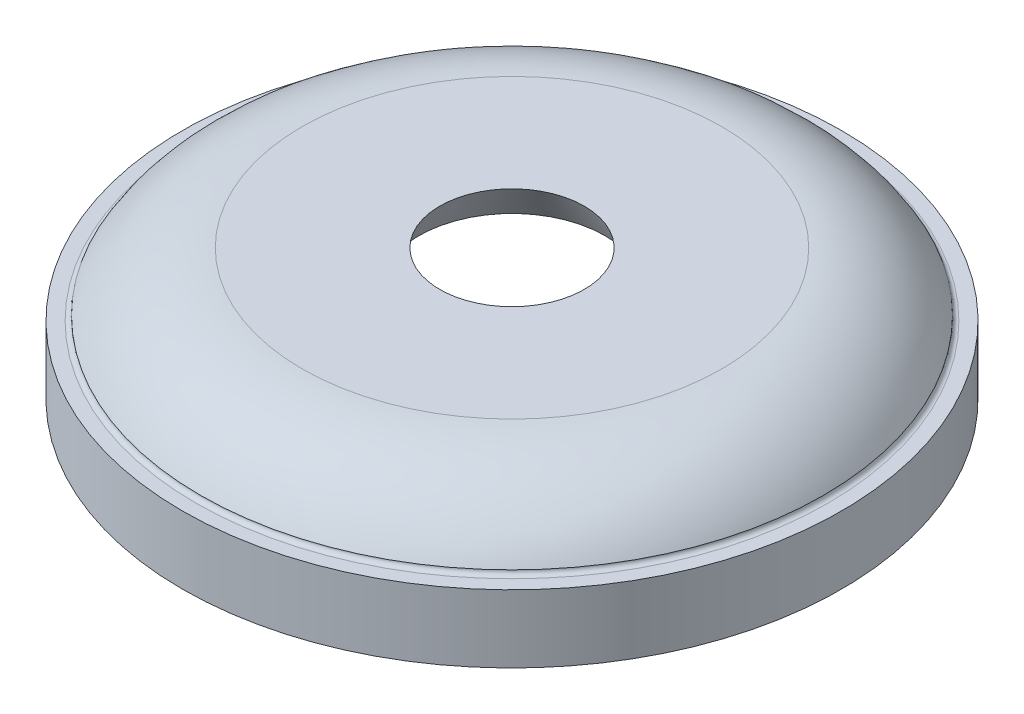
ISO-10303-21;
HEADER;
FILE_DESCRIPTION(('STEP AP214'),'2;1');
FILE_NAME('part.step','',(''),(''),'','','');
FILE_SCHEMA(('AUTOMOTIVE_DESIGN { 1 0 10303 214 1 1 1 1 }'));
ENDSEC;
DATA;
#1=APPLICATION_CONTEXT('core data for automotive mechanical design processes');
#2=APPLICATION_PROTOCOL_DEFINITION('international standard','automotive_design',2000,#1);
#3=PRODUCT_CONTEXT('',#1,'mechanical');
#4=PRODUCT('Part','Part','',(#3));
#5=PRODUCT_RELATED_PRODUCT_CATEGORY('part','',(#4));
#6=PRODUCT_DEFINITION_FORMATION('','',#4);
#7=PRODUCT_DEFINITION_CONTEXT('part definition',#1,'design');
#8=PRODUCT_DEFINITION('design','',#6,#7);
#9=PRODUCT_DEFINITION_SHAPE('','',#8);
#10=(LENGTH_UNIT() NAMED_UNIT(*) SI_UNIT(.MILLI.,.METRE.));
#11=(NAMED_UNIT(*) PLANE_ANGLE_UNIT() SI_UNIT($,.RADIAN.));
#12=(NAMED_UNIT(*) SI_UNIT($,.STERADIAN.) SOLID_ANGLE_UNIT());
#13=UNCERTAINTY_MEASURE_WITH_UNIT(LENGTH_MEASURE(1.E-05),#10,'distance_accuracy_value','');
#14=(GEOMETRIC_REPRESENTATION_CONTEXT(3) GLOBAL_UNCERTAINTY_ASSIGNED_CONTEXT((#13)) GLOBAL_UNIT_ASSIGNED_CONTEXT((#10,
#11,#12)) REPRESENTATION_CONTEXT('',''));
#15=CARTESIAN_POINT('',(0.,0.,0.));
#16=DIRECTION('',(0.,0.,1.));
#17=DIRECTION('',(1.,0.,0.));
#18=AXIS2_PLACEMENT_3D('',#15,#16,#17);
#19=CARTESIAN_POINT('',(0.,0.,0.));
#20=DIRECTION('',(0.,-1.,0.));
#21=DIRECTION('',(0.,0.,-1.));
#22=AXIS2_PLACEMENT_3D('',#19,#20,#21);
#23=CYLINDRICAL_SURFACE('',#22,71.);
#24=CARTESIAN_POINT('',(0.,3.,0.));
#25=DIRECTION('',(0.,-1.,0.));
#26=DIRECTION('',(0.,0.,-1.));
#27=AXIS2_PLACEMENT_3D('',#24,#25,#26);
#28=CIRCLE('',#27,71.);
#29=CARTESIAN_POINT('',(0.,3.,-71.));
#30=VERTEX_POINT('',#29);
#31=EDGE_CURVE('E74',#30,#30,#28,.T.);
#32=ORIENTED_EDGE('',*,*,#31,.F.);
#33=EDGE_LOOP('',(#32));
#34=FACE_BOUND('',#33,.T.);
#35=CARTESIAN_POINT('',(0.,0.,0.));
#36=DIRECTION('',(0.,-1.,0.));
#37=DIRECTION('',(0.,0.,-1.));
#38=AXIS2_PLACEMENT_3D('',#35,#36,#37);
#39=CIRCLE('',#38,71.);
#40=CARTESIAN_POINT('',(0.,0.,-71.));
#41=VERTEX_POINT('',#40);
#42=EDGE_CURVE('E40',#41,#41,#39,.T.);
#43=ORIENTED_EDGE('',*,*,#42,.T.);
#44=EDGE_LOOP('',(#43));
#45=FACE_BOUND('',#44,.T.);
#46=ADVANCED_FACE('F33',(#34,#45),#23,.F.);
#47=CARTESIAN_POINT('',(-71.,0.,0.));
#48=DIRECTION('',(0.,1.,0.));
#49=DIRECTION('',(0.,0.,1.));
#50=AXIS2_PLACEMENT_3D('',#47,#48,#49);
#51=PLANE('',#50);
#52=ORIENTED_EDGE('',*,*,#42,.F.);
#53=EDGE_LOOP('',(#52));
#54=FACE_BOUND('',#53,.T.);
#55=CARTESIAN_POINT('',(0.,0.,0.));
#56=DIRECTION('',(0.,-1.,0.));
#57=DIRECTION('',(0.,0.,-1.));
#58=AXIS2_PLACEMENT_3D('',#55,#56,#57);
#59=CIRCLE('',#58,73.);
#60=CARTESIAN_POINT('',(0.,0.,-73.));
#61=VERTEX_POINT('',#60);
#62=EDGE_CURVE('E44',#61,#61,#59,.T.);
#63=ORIENTED_EDGE('',*,*,#62,.T.);
#64=EDGE_LOOP('',(#63));
#65=FACE_BOUND('',#64,.T.);
#66=ADVANCED_FACE('F81',(#54,#65),#51,.F.);
#67=CARTESIAN_POINT('',(0.,0.,0.));
#68=DIRECTION('',(0.,-1.,0.));
#69=DIRECTION('',(0.,0.,-1.));
#70=AXIS2_PLACEMENT_3D('',#67,#68,#69);
#71=CYLINDRICAL_SURFACE('',#70,73.);
#72=ORIENTED_EDGE('',*,*,#62,.F.);
#73=EDGE_LOOP('',(#72));
#74=FACE_BOUND('',#73,.T.);
#75=CARTESIAN_POINT('',(0.,15.,0.));
#76=DIRECTION('',(0.,-1.,0.));
#77=DIRECTION('',(0.,0.,-1.));
#78=AXIS2_PLACEMENT_3D('',#75,#76,#77);
#79=CIRCLE('',#78,73.);
#80=CARTESIAN_POINT('',(0.,15.,-73.));
#81=VERTEX_POINT('',#80);
#82=EDGE_CURVE('E48',#81,#81,#79,.T.);
#83=ORIENTED_EDGE('',*,*,#82,.T.);
#84=EDGE_LOOP('',(#83));
#85=FACE_BOUND('',#84,.T.);
#86=ADVANCED_FACE('F85',(#74,#85),#71,.T.);
#87=CARTESIAN_POINT('',(-73.,15.,0.));
#88=DIRECTION('',(0.,-1.,0.));
#89=DIRECTION('',(0.,0.,-1.));
#90=AXIS2_PLACEMENT_3D('',#87,#88,#89);
#91=PLANE('',#90);
#92=CARTESIAN_POINT('',(0.,15.,0.));
#93=DIRECTION('',(0.,-1.,0.));
#94=DIRECTION('',(0.,0.,-1.));
#95=AXIS2_PLACEMENT_3D('',#92,#93,#94);
#96=CIRCLE('',#95,70.0000000000046);
#97=CARTESIAN_POINT('',(0.,15.,-70.0000000000046));
#98=VERTEX_POINT('',#97);
#99=EDGE_CURVE('E10',#98,#98,#96,.T.);
#100=ORIENTED_EDGE('',*,*,#99,.T.);
#101=EDGE_LOOP('',(#100));
#102=FACE_BOUND('',#101,.T.);
#103=ORIENTED_EDGE('',*,*,#82,.F.);
#104=EDGE_LOOP('',(#103));
#105=FACE_BOUND('',#104,.T.);
#106=ADVANCED_FACE('F91',(#102,#105),#91,.F.);
#107=CARTESIAN_POINT('',(0.,3.00000000000002,0.));
#108=DIRECTION('',(0.,-1.,0.));
#109=DIRECTION('',(0.,0.,-1.));
#110=AXIS2_PLACEMENT_3D('',#107,#108,#109);
#111=TOROIDAL_SURFACE('',#110,46.4833395016092,26.);
#112=CARTESIAN_POINT('',(0.,16.0000000000001,0.));
#113=DIRECTION('',(0.,-1.,0.));
#114=DIRECTION('',(0.,0.,-1.));
#115=AXIS2_PLACEMENT_3D('',#112,#113,#114);
#116=CIRCLE('',#115,69.0000000000046);
#117=CARTESIAN_POINT('',(0.,16.0000000000001,-69.0000000000046));
#118=VERTEX_POINT('',#117);
#119=EDGE_CURVE('E53',#118,#118,#116,.T.);
#120=ORIENTED_EDGE('',*,*,#119,.F.);
#121=EDGE_LOOP('',(#120));
#122=FACE_BOUND('',#121,.T.);
#123=CARTESIAN_POINT('',(0.,29.,0.));
#124=DIRECTION('',(0.,-1.,0.));
#125=DIRECTION('',(0.,0.,-1.));
#126=AXIS2_PLACEMENT_3D('',#123,#124,#125);
#127=CIRCLE('',#126,46.4833395016092);
#128=CARTESIAN_POINT('',(0.,29.,-46.4833395016092));
#129=VERTEX_POINT('',#128);
#130=EDGE_CURVE('E56',#129,#129,#127,.T.);
#131=ORIENTED_EDGE('',*,*,#130,.T.);
#132=EDGE_LOOP('',(#131));
#133=FACE_BOUND('',#132,.T.);
#134=ADVANCED_FACE('F95',(#122,#133),#111,.T.);
#135=CARTESIAN_POINT('',(-16.,29.,0.));
#136=DIRECTION('',(0.,-1.,0.));
#137=DIRECTION('',(0.,0.,-1.));
#138=AXIS2_PLACEMENT_3D('',#135,#136,#137);
#139=PLANE('',#138);
#140=ORIENTED_EDGE('',*,*,#130,.F.);
#141=EDGE_LOOP('',(#140));
#142=FACE_BOUND('',#141,.T.);
#143=CARTESIAN_POINT('',(0.,29.,0.));
#144=DIRECTION('',(0.,-1.,0.));
#145=DIRECTION('',(0.,0.,-1.));
#146=AXIS2_PLACEMENT_3D('',#143,#144,#145);
#147=CIRCLE('',#146,16.);
#148=CARTESIAN_POINT('',(0.,29.,-16.));
#149=VERTEX_POINT('',#148);
#150=EDGE_CURVE('E59',#149,#149,#147,.T.);
#151=ORIENTED_EDGE('',*,*,#150,.T.);
#152=EDGE_LOOP('',(#151));
#153=FACE_BOUND('',#152,.T.);
#154=ADVANCED_FACE('F98',(#142,#153),#139,.F.);
#155=CARTESIAN_POINT('',(0.,21.,0.));
#156=DIRECTION('',(0.,-1.,0.));
#157=DIRECTION('',(0.,0.,-1.));
#158=AXIS2_PLACEMENT_3D('',#155,#156,#157);
#159=CONICAL_SURFACE('',#158,20.618802153517,0.5235987755983);
#160=ORIENTED_EDGE('',*,*,#150,.F.);
#161=EDGE_LOOP('',(#160));
#162=FACE_BOUND('',#161,.T.);
#163=CARTESIAN_POINT('',(0.,21.,0.));
#164=DIRECTION('',(0.,-1.,0.));
#165=DIRECTION('',(0.,0.,-1.));
#166=AXIS2_PLACEMENT_3D('',#163,#164,#165);
#167=CIRCLE('',#166,20.618802153517);
#168=CARTESIAN_POINT('',(0.,21.,-20.618802153517));
#169=VERTEX_POINT('',#168);
#170=EDGE_CURVE('E62',#169,#169,#167,.T.);
#171=ORIENTED_EDGE('',*,*,#170,.T.);
#172=EDGE_LOOP('',(#171));
#173=FACE_BOUND('',#172,.T.);
#174=ADVANCED_FACE('F102',(#162,#173),#159,.F.);
#175=CARTESIAN_POINT('',(-46.4833395016092,21.,0.));
#176=DIRECTION('',(0.,1.,0.));
#177=DIRECTION('',(0.,0.,1.));
#178=AXIS2_PLACEMENT_3D('',#175,#176,#177);
#179=PLANE('',#178);
#180=ORIENTED_EDGE('',*,*,#170,.F.);
#181=EDGE_LOOP('',(#180));
#182=FACE_BOUND('',#181,.T.);
#183=CARTESIAN_POINT('',(0.,21.,0.));
#184=DIRECTION('',(0.,-1.,0.));
#185=DIRECTION('',(0.,0.,-1.));
#186=AXIS2_PLACEMENT_3D('',#183,#184,#185);
#187=CIRCLE('',#186,46.4833395016092);
#188=CARTESIAN_POINT('',(0.,21.,-46.4833395016092));
#189=VERTEX_POINT('',#188);
#190=EDGE_CURVE('E65',#189,#189,#187,.T.);
#191=ORIENTED_EDGE('',*,*,#190,.T.);
#192=EDGE_LOOP('',(#191));
#193=FACE_BOUND('',#192,.T.);
#194=ADVANCED_FACE('F106',(#182,#193),#179,.F.);
#195=CARTESIAN_POINT('',(0.,-1.86334942964943,0.));
#196=DIRECTION('',(0.,-1.,0.));
#197=DIRECTION('',(0.,0.,-1.));
#198=AXIS2_PLACEMENT_3D('',#195,#196,#197);
#199=TOROIDAL_SURFACE('',#198,46.4833395016092,22.8633494296494);
#200=ORIENTED_EDGE('',*,*,#190,.F.);
#201=EDGE_LOOP('',(#200));
#202=FACE_BOUND('',#201,.T.);
#203=CARTESIAN_POINT('',(0.,5.65753248528833,0.));
#204=DIRECTION('',(0.,-1.,0.));
#205=DIRECTION('',(0.,0.,-1.));
#206=AXIS2_PLACEMENT_3D('',#203,#204,#205);
#207=CIRCLE('',#206,68.0742885859782);
#208=CARTESIAN_POINT('',(0.,5.65753248528833,-68.0742885859782));
#209=VERTEX_POINT('',#208);
#210=EDGE_CURVE('E68',#209,#209,#207,.T.);
#211=ORIENTED_EDGE('',*,*,#210,.T.);
#212=EDGE_LOOP('',(#211));
#213=FACE_BOUND('',#212,.T.);
#214=ADVANCED_FACE('F110',(#202,#213),#199,.F.);
#215=CARTESIAN_POINT('',(0.,3.,0.));
#216=DIRECTION('',(0.,-1.,0.));
#217=DIRECTION('',(0.,0.,-1.));
#218=AXIS2_PLACEMENT_3D('',#215,#216,#217);
#219=CONICAL_SURFACE('',#218,69.,0.335190698689145);
#220=ORIENTED_EDGE('',*,*,#210,.F.);
#221=EDGE_LOOP('',(#220));
#222=FACE_BOUND('',#221,.T.);
#223=CARTESIAN_POINT('',(0.,3.,0.));
#224=DIRECTION('',(0.,-1.,0.));
#225=DIRECTION('',(0.,0.,-1.));
#226=AXIS2_PLACEMENT_3D('',#223,#224,#225);
#227=CIRCLE('',#226,69.);
#228=CARTESIAN_POINT('',(0.,3.,-69.));
#229=VERTEX_POINT('',#228);
#230=EDGE_CURVE('E71',#229,#229,#227,.T.);
#231=ORIENTED_EDGE('',*,*,#230,.T.);
#232=EDGE_LOOP('',(#231));
#233=FACE_BOUND('',#232,.T.);
#234=ADVANCED_FACE('F114',(#222,#233),#219,.F.);
#235=CARTESIAN_POINT('',(-71.,3.,0.));
#236=DIRECTION('',(0.,1.,0.));
#237=DIRECTION('',(0.,0.,1.));
#238=AXIS2_PLACEMENT_3D('',#235,#236,#237);
#239=PLANE('',#238);
#240=ORIENTED_EDGE('',*,*,#230,.F.);
#241=EDGE_LOOP('',(#240));
#242=FACE_BOUND('',#241,.T.);
#243=ORIENTED_EDGE('',*,*,#31,.T.);
#244=EDGE_LOOP('',(#243));
#245=FACE_BOUND('',#244,.T.);
#246=ADVANCED_FACE('F78',(#242,#245),#239,.F.);
#247=CARTESIAN_POINT('',(0.,16.,0.));
#248=DIRECTION('',(0.,-1.,0.));
#249=DIRECTION('',(0.,0.,-1.));
#250=AXIS2_PLACEMENT_3D('',#247,#248,#249);
#251=TOROIDAL_SURFACE('',#250,70.0000000000046,1.);
#252=ORIENTED_EDGE('',*,*,#119,.T.);
#253=EDGE_LOOP('',(#252));
#254=FACE_BOUND('',#253,.T.);
#255=ORIENTED_EDGE('',*,*,#99,.F.);
#256=EDGE_LOOP('',(#255));
#257=FACE_BOUND('',#256,.T.);
#258=ADVANCED_FACE('F35',(#254,#257),#251,.F.);
#259=CLOSED_SHELL('',(#46,#66,#86,#106,#134,#154,#174,#194,#214,#234,#246,#258));
#260=MANIFOLD_SOLID_BREP('B2',#259);
#261=ADVANCED_BREP_SHAPE_REPRESENTATION('',(#18,#260),#14);
#262=SHAPE_DEFINITION_REPRESENTATION(#9,#261);
ENDSEC;
END-ISO-10303-21;
